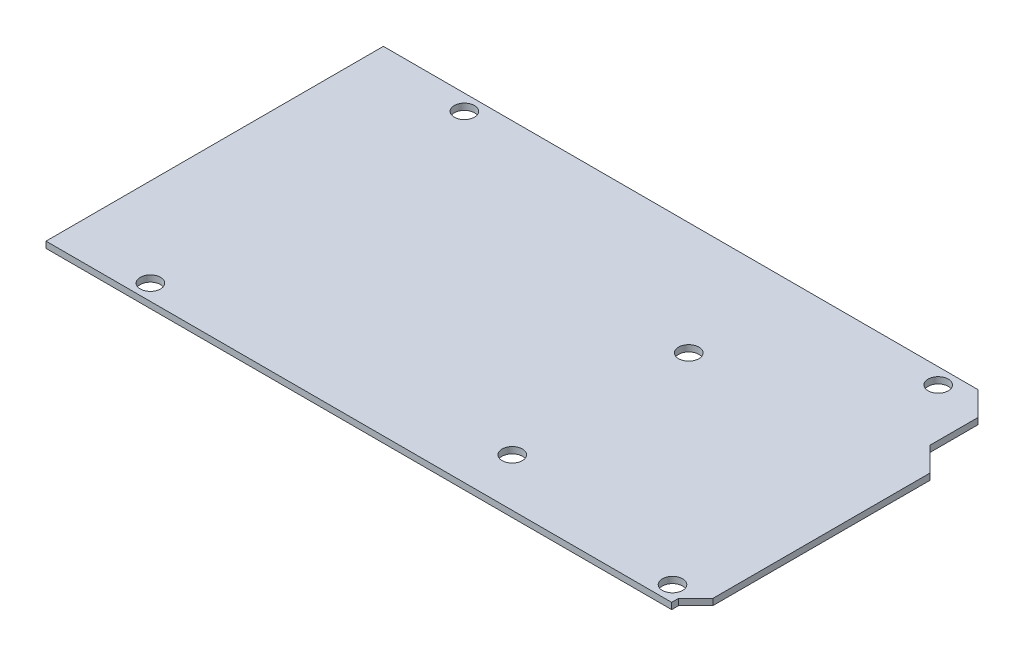
ISO-10303-21;
HEADER;
FILE_DESCRIPTION(('STEP AP214'),'2;1');
FILE_NAME('part.step','',(''),(''),'','','');
FILE_SCHEMA(('AUTOMOTIVE_DESIGN { 1 0 10303 214 1 1 1 1 }'));
ENDSEC;
DATA;
#1=APPLICATION_CONTEXT('core data for automotive mechanical design processes');
#2=APPLICATION_PROTOCOL_DEFINITION('international standard','automotive_design',2000,#1);
#3=PRODUCT_CONTEXT('',#1,'mechanical');
#4=PRODUCT('Part','Part','',(#3));
#5=PRODUCT_RELATED_PRODUCT_CATEGORY('part','',(#4));
#6=PRODUCT_DEFINITION_FORMATION('','',#4);
#7=PRODUCT_DEFINITION_CONTEXT('part definition',#1,'design');
#8=PRODUCT_DEFINITION('design','',#6,#7);
#9=PRODUCT_DEFINITION_SHAPE('','',#8);
#10=(LENGTH_UNIT() NAMED_UNIT(*) SI_UNIT(.MILLI.,.METRE.));
#11=(NAMED_UNIT(*) PLANE_ANGLE_UNIT() SI_UNIT($,.RADIAN.));
#12=(NAMED_UNIT(*) SI_UNIT($,.STERADIAN.) SOLID_ANGLE_UNIT());
#13=UNCERTAINTY_MEASURE_WITH_UNIT(LENGTH_MEASURE(1.E-05),#10,'distance_accuracy_value','');
#14=(GEOMETRIC_REPRESENTATION_CONTEXT(3) GLOBAL_UNCERTAINTY_ASSIGNED_CONTEXT((#13)) GLOBAL_UNIT_ASSIGNED_CONTEXT((#10,
#11,#12)) REPRESENTATION_CONTEXT('',''));
#15=CARTESIAN_POINT('',(0.,0.,0.));
#16=DIRECTION('',(0.,0.,1.));
#17=DIRECTION('',(1.,0.,0.));
#18=AXIS2_PLACEMENT_3D('',#15,#16,#17);
#19=CARTESIAN_POINT('',(48.9000000000001,1.,48.9));
#20=DIRECTION('',(0.707106781186548,0.,0.707106781186547));
#21=DIRECTION('',(0.707106781186547,0.,-0.707106781186548));
#22=AXIS2_PLACEMENT_3D('',#19,#20,#21);
#23=PLANE('',#22);
#24=DIRECTION('',(-0.707106781186547,0.,0.707106781186548));
#25=VECTOR('',#24,1.);
#26=CARTESIAN_POINT('',(48.9000000000001,0.,48.9));
#27=LINE('',#26,#25);
#28=CARTESIAN_POINT('',(101.61,0.,-3.80999999999999));
#29=VERTEX_POINT('',#28);
#30=CARTESIAN_POINT('',(98.9,0.,-1.09999999999999));
#31=VERTEX_POINT('',#30);
#32=EDGE_CURVE('E171',#29,#31,#27,.T.);
#33=ORIENTED_EDGE('',*,*,#32,.F.);
#34=DIRECTION('',(0.,-1.,0.));
#35=VECTOR('',#34,1.);
#36=CARTESIAN_POINT('',(101.61,1.,-3.80999999999999));
#37=LINE('',#36,#35);
#38=CARTESIAN_POINT('',(101.61,1.,-3.80999999999999));
#39=VERTEX_POINT('',#38);
#40=EDGE_CURVE('E11',#39,#29,#37,.T.);
#41=ORIENTED_EDGE('',*,*,#40,.F.);
#42=DIRECTION('',(-0.707106781186547,0.,0.707106781186548));
#43=VECTOR('',#42,1.);
#44=CARTESIAN_POINT('',(48.9000000000001,1.,48.9));
#45=LINE('',#44,#43);
#46=CARTESIAN_POINT('',(98.9,1.,-1.09999999999999));
#47=VERTEX_POINT('',#46);
#48=EDGE_CURVE('E432',#39,#47,#45,.T.);
#49=ORIENTED_EDGE('',*,*,#48,.T.);
#50=DIRECTION('',(0.,-1.,0.));
#51=VECTOR('',#50,1.);
#52=CARTESIAN_POINT('',(98.9,1.,-1.09999999999999));
#53=LINE('',#52,#51);
#54=EDGE_CURVE('E57',#47,#31,#53,.T.);
#55=ORIENTED_EDGE('',*,*,#54,.T.);
#56=EDGE_LOOP('',(#33,#41,#49,#55));
#57=FACE_BOUND('',#56,.T.);
#58=ADVANCED_FACE('F39',(#57),#23,.T.);
#59=CARTESIAN_POINT('',(101.61,1.,0.));
#60=DIRECTION('',(-1.,0.,0.));
#61=DIRECTION('',(0.,0.,1.));
#62=AXIS2_PLACEMENT_3D('',#59,#60,#61);
#63=PLANE('',#62);
#64=DIRECTION('',(0.,0.,-1.));
#65=VECTOR('',#64,1.);
#66=CARTESIAN_POINT('',(101.61,0.,0.));
#67=LINE('',#66,#65);
#68=CARTESIAN_POINT('',(101.61,0.,-38.09));
#69=VERTEX_POINT('',#68);
#70=EDGE_CURVE('E174',#29,#69,#67,.T.);
#71=ORIENTED_EDGE('',*,*,#70,.T.);
#72=DIRECTION('',(0.,-1.,0.));
#73=VECTOR('',#72,1.);
#74=CARTESIAN_POINT('',(101.61,1.,-38.09));
#75=LINE('',#74,#73);
#76=CARTESIAN_POINT('',(101.61,1.,-38.09));
#77=VERTEX_POINT('',#76);
#78=EDGE_CURVE('E49',#77,#69,#75,.T.);
#79=ORIENTED_EDGE('',*,*,#78,.F.);
#80=DIRECTION('',(0.,0.,-1.));
#81=VECTOR('',#80,1.);
#82=CARTESIAN_POINT('',(101.61,1.,0.));
#83=LINE('',#82,#81);
#84=EDGE_CURVE('E427',#39,#77,#83,.T.);
#85=ORIENTED_EDGE('',*,*,#84,.F.);
#86=ORIENTED_EDGE('',*,*,#40,.T.);
#87=EDGE_LOOP('',(#71,#79,#85,#86));
#88=FACE_BOUND('',#87,.T.);
#89=ADVANCED_FACE('F228',(#88),#63,.F.);
#90=CARTESIAN_POINT('',(69.8500000000001,1.,-69.85));
#91=DIRECTION('',(-0.707106781186548,0.,0.707106781186547));
#92=DIRECTION('',(0.707106781186547,0.,0.707106781186548));
#93=AXIS2_PLACEMENT_3D('',#90,#91,#92);
#94=PLANE('',#93);
#95=DIRECTION('',(-0.707106781186547,0.,-0.707106781186548));
#96=VECTOR('',#95,1.);
#97=CARTESIAN_POINT('',(69.8500000000001,0.,-69.85));
#98=LINE('',#97,#96);
#99=CARTESIAN_POINT('',(97.8,0.,-41.9));
#100=VERTEX_POINT('',#99);
#101=EDGE_CURVE('E178',#69,#100,#98,.T.);
#102=ORIENTED_EDGE('',*,*,#101,.T.);
#103=DIRECTION('',(0.,-1.,0.));
#104=VECTOR('',#103,1.);
#105=CARTESIAN_POINT('',(97.8,1.,-41.9));
#106=LINE('',#105,#104);
#107=CARTESIAN_POINT('',(97.8,1.,-41.9));
#108=VERTEX_POINT('',#107);
#109=EDGE_CURVE('E216',#108,#100,#106,.T.);
#110=ORIENTED_EDGE('',*,*,#109,.F.);
#111=DIRECTION('',(-0.707106781186547,0.,-0.707106781186548));
#112=VECTOR('',#111,1.);
#113=CARTESIAN_POINT('',(69.8500000000001,1.,-69.85));
#114=LINE('',#113,#112);
#115=EDGE_CURVE('E224',#77,#108,#114,.T.);
#116=ORIENTED_EDGE('',*,*,#115,.F.);
#117=ORIENTED_EDGE('',*,*,#78,.T.);
#118=EDGE_LOOP('',(#102,#110,#116,#117));
#119=FACE_BOUND('',#118,.T.);
#120=ADVANCED_FACE('F222',(#119),#94,.F.);
#121=CARTESIAN_POINT('',(97.8,1.,0.));
#122=DIRECTION('',(1.,0.,0.));
#123=DIRECTION('',(0.,0.,-1.));
#124=AXIS2_PLACEMENT_3D('',#121,#122,#123);
#125=PLANE('',#124);
#126=DIRECTION('',(0.,0.,1.));
#127=VECTOR('',#126,1.);
#128=CARTESIAN_POINT('',(97.8,0.,0.));
#129=LINE('',#128,#127);
#130=CARTESIAN_POINT('',(97.8,0.,-49.52));
#131=VERTEX_POINT('',#130);
#132=EDGE_CURVE('E182',#131,#100,#129,.T.);
#133=ORIENTED_EDGE('',*,*,#132,.F.);
#134=DIRECTION('',(0.,-1.,0.));
#135=VECTOR('',#134,1.);
#136=CARTESIAN_POINT('',(97.8,1.,-49.52));
#137=LINE('',#136,#135);
#138=CARTESIAN_POINT('',(97.8,1.,-49.52));
#139=VERTEX_POINT('',#138);
#140=EDGE_CURVE('E213',#139,#131,#137,.T.);
#141=ORIENTED_EDGE('',*,*,#140,.F.);
#142=DIRECTION('',(0.,0.,1.));
#143=VECTOR('',#142,1.);
#144=CARTESIAN_POINT('',(97.8,1.,0.));
#145=LINE('',#144,#143);
#146=EDGE_CURVE('E423',#139,#108,#145,.T.);
#147=ORIENTED_EDGE('',*,*,#146,.T.);
#148=ORIENTED_EDGE('',*,*,#109,.T.);
#149=EDGE_LOOP('',(#133,#141,#147,#148));
#150=FACE_BOUND('',#149,.T.);
#151=ADVANCED_FACE('F302',(#150),#125,.T.);
#152=CARTESIAN_POINT('',(73.6600000000001,1.,-73.66));
#153=DIRECTION('',(-0.707106781186548,0.,0.707106781186547));
#154=DIRECTION('',(0.707106781186547,0.,0.707106781186548));
#155=AXIS2_PLACEMENT_3D('',#152,#153,#154);
#156=PLANE('',#155);
#157=DIRECTION('',(-0.707106781186547,0.,-0.707106781186548));
#158=VECTOR('',#157,1.);
#159=CARTESIAN_POINT('',(73.6600000000001,0.,-73.66));
#160=LINE('',#159,#158);
#161=CARTESIAN_POINT('',(93.99,0.,-53.33));
#162=VERTEX_POINT('',#161);
#163=EDGE_CURVE('E186',#131,#162,#160,.T.);
#164=ORIENTED_EDGE('',*,*,#163,.T.);
#165=DIRECTION('',(0.,-1.,0.));
#166=VECTOR('',#165,1.);
#167=CARTESIAN_POINT('',(93.99,1.,-53.33));
#168=LINE('',#167,#166);
#169=CARTESIAN_POINT('',(93.99,1.,-53.33));
#170=VERTEX_POINT('',#169);
#171=EDGE_CURVE('E210',#170,#162,#168,.T.);
#172=ORIENTED_EDGE('',*,*,#171,.F.);
#173=DIRECTION('',(-0.707106781186547,0.,-0.707106781186548));
#174=VECTOR('',#173,1.);
#175=CARTESIAN_POINT('',(73.6600000000001,1.,-73.66));
#176=LINE('',#175,#174);
#177=EDGE_CURVE('E141',#139,#170,#176,.T.);
#178=ORIENTED_EDGE('',*,*,#177,.F.);
#179=ORIENTED_EDGE('',*,*,#140,.T.);
#180=EDGE_LOOP('',(#164,#172,#178,#179));
#181=FACE_BOUND('',#180,.T.);
#182=ADVANCED_FACE('F298',(#181),#156,.F.);
#183=CARTESIAN_POINT('',(0.,1.,-53.33));
#184=DIRECTION('',(0.,0.,-1.));
#185=DIRECTION('',(-1.,0.,0.));
#186=AXIS2_PLACEMENT_3D('',#183,#184,#185);
#187=PLANE('',#186);
#188=DIRECTION('',(1.,0.,0.));
#189=VECTOR('',#188,1.);
#190=CARTESIAN_POINT('',(0.,0.,-53.33));
#191=LINE('',#190,#189);
#192=CARTESIAN_POINT('',(0.,0.,-53.33));
#193=VERTEX_POINT('',#192);
#194=EDGE_CURVE('E190',#193,#162,#191,.T.);
#195=ORIENTED_EDGE('',*,*,#194,.F.);
#196=DIRECTION('',(0.,-1.,0.));
#197=VECTOR('',#196,1.);
#198=CARTESIAN_POINT('',(0.,1.,-53.33));
#199=LINE('',#198,#197);
#200=CARTESIAN_POINT('',(0.,1.,-53.33));
#201=VERTEX_POINT('',#200);
#202=EDGE_CURVE('E124',#201,#193,#199,.T.);
#203=ORIENTED_EDGE('',*,*,#202,.F.);
#204=DIRECTION('',(1.,0.,0.));
#205=VECTOR('',#204,1.);
#206=CARTESIAN_POINT('',(0.,1.,-53.33));
#207=LINE('',#206,#205);
#208=EDGE_CURVE('E137',#201,#170,#207,.T.);
#209=ORIENTED_EDGE('',*,*,#208,.T.);
#210=ORIENTED_EDGE('',*,*,#171,.T.);
#211=EDGE_LOOP('',(#195,#203,#209,#210));
#212=FACE_BOUND('',#211,.T.);
#213=ADVANCED_FACE('F295',(#212),#187,.T.);
#214=CARTESIAN_POINT('',(0.,1.,0.));
#215=DIRECTION('',(-1.,0.,0.));
#216=DIRECTION('',(0.,0.,1.));
#217=AXIS2_PLACEMENT_3D('',#214,#215,#216);
#218=PLANE('',#217);
#219=DIRECTION('',(0.,0.,-1.));
#220=VECTOR('',#219,1.);
#221=CARTESIAN_POINT('',(0.,0.,0.));
#222=LINE('',#221,#220);
#223=CARTESIAN_POINT('',(0.,0.,0.));
#224=VERTEX_POINT('',#223);
#225=EDGE_CURVE('E120',#224,#193,#222,.T.);
#226=ORIENTED_EDGE('',*,*,#225,.F.);
#227=DIRECTION('',(0.,-1.,0.));
#228=VECTOR('',#227,1.);
#229=CARTESIAN_POINT('',(0.,1.,0.));
#230=LINE('',#229,#228);
#231=CARTESIAN_POINT('',(0.,1.,0.));
#232=VERTEX_POINT('',#231);
#233=EDGE_CURVE('E114',#232,#224,#230,.T.);
#234=ORIENTED_EDGE('',*,*,#233,.F.);
#235=DIRECTION('',(0.,0.,-1.));
#236=VECTOR('',#235,1.);
#237=CARTESIAN_POINT('',(0.,1.,0.));
#238=LINE('',#237,#236);
#239=EDGE_CURVE('E118',#232,#201,#238,.T.);
#240=ORIENTED_EDGE('',*,*,#239,.T.);
#241=ORIENTED_EDGE('',*,*,#202,.T.);
#242=EDGE_LOOP('',(#226,#234,#240,#241));
#243=FACE_BOUND('',#242,.T.);
#244=ADVANCED_FACE('F116',(#243),#218,.T.);
#245=CARTESIAN_POINT('',(0.,1.,0.));
#246=DIRECTION('',(0.,0.,-1.));
#247=DIRECTION('',(-1.,0.,0.));
#248=AXIS2_PLACEMENT_3D('',#245,#246,#247);
#249=PLANE('',#248);
#250=DIRECTION('',(1.,0.,0.));
#251=VECTOR('',#250,1.);
#252=CARTESIAN_POINT('',(0.,0.,0.));
#253=LINE('',#252,#251);
#254=CARTESIAN_POINT('',(98.9,0.,0.));
#255=VERTEX_POINT('',#254);
#256=EDGE_CURVE('E196',#224,#255,#253,.T.);
#257=ORIENTED_EDGE('',*,*,#256,.T.);
#258=DIRECTION('',(0.,-1.,0.));
#259=VECTOR('',#258,1.);
#260=CARTESIAN_POINT('',(98.9,1.,0.));
#261=LINE('',#260,#259);
#262=CARTESIAN_POINT('',(98.9,1.,0.));
#263=VERTEX_POINT('',#262);
#264=EDGE_CURVE('E86',#263,#255,#261,.T.);
#265=ORIENTED_EDGE('',*,*,#264,.F.);
#266=DIRECTION('',(1.,0.,0.));
#267=VECTOR('',#266,1.);
#268=CARTESIAN_POINT('',(0.,1.,0.));
#269=LINE('',#268,#267);
#270=EDGE_CURVE('E126',#232,#263,#269,.T.);
#271=ORIENTED_EDGE('',*,*,#270,.F.);
#272=ORIENTED_EDGE('',*,*,#233,.T.);
#273=EDGE_LOOP('',(#257,#265,#271,#272));
#274=FACE_BOUND('',#273,.T.);
#275=ADVANCED_FACE('F127',(#274),#249,.F.);
#276=CARTESIAN_POINT('',(14.,1.,-2.5));
#277=DIRECTION('',(0.,-1.,0.));
#278=DIRECTION('',(0.,0.,-1.));
#279=AXIS2_PLACEMENT_3D('',#276,#277,#278);
#280=CYLINDRICAL_SURFACE('',#279,1.6);
#281=CARTESIAN_POINT('',(14.,1.,-2.5));
#282=DIRECTION('',(0.,1.,0.));
#283=DIRECTION('',(0.,0.,1.));
#284=AXIS2_PLACEMENT_3D('',#281,#282,#283);
#285=CIRCLE('',#284,1.6);
#286=CARTESIAN_POINT('',(14.,1.,-0.899999999999998));
#287=VERTEX_POINT('',#286);
#288=EDGE_CURVE('E435',#287,#287,#285,.T.);
#289=ORIENTED_EDGE('',*,*,#288,.T.);
#290=EDGE_LOOP('',(#289));
#291=FACE_BOUND('',#290,.T.);
#292=CARTESIAN_POINT('',(14.,0.,-2.5));
#293=DIRECTION('',(0.,1.,0.));
#294=DIRECTION('',(0.,0.,1.));
#295=AXIS2_PLACEMENT_3D('',#292,#293,#294);
#296=CIRCLE('',#295,1.6);
#297=CARTESIAN_POINT('',(14.,0.,-0.899999999999998));
#298=VERTEX_POINT('',#297);
#299=EDGE_CURVE('E167',#298,#298,#296,.T.);
#300=ORIENTED_EDGE('',*,*,#299,.F.);
#301=EDGE_LOOP('',(#300));
#302=FACE_BOUND('',#301,.T.);
#303=ADVANCED_FACE('F239',(#291,#302),#280,.F.);
#304=CARTESIAN_POINT('',(15.3,1.,-50.83));
#305=DIRECTION('',(0.,-1.,0.));
#306=DIRECTION('',(0.,0.,-1.));
#307=AXIS2_PLACEMENT_3D('',#304,#305,#306);
#308=CYLINDRICAL_SURFACE('',#307,1.6);
#309=CARTESIAN_POINT('',(15.3,1.,-50.83));
#310=DIRECTION('',(0.,1.,0.));
#311=DIRECTION('',(0.,0.,1.));
#312=AXIS2_PLACEMENT_3D('',#309,#310,#311);
#313=CIRCLE('',#312,1.6);
#314=CARTESIAN_POINT('',(15.3,1.,-49.23));
#315=VERTEX_POINT('',#314);
#316=EDGE_CURVE('E439',#315,#315,#313,.T.);
#317=ORIENTED_EDGE('',*,*,#316,.T.);
#318=EDGE_LOOP('',(#317));
#319=FACE_BOUND('',#318,.T.);
#320=CARTESIAN_POINT('',(15.3,0.,-50.83));
#321=DIRECTION('',(0.,1.,0.));
#322=DIRECTION('',(0.,0.,1.));
#323=AXIS2_PLACEMENT_3D('',#320,#321,#322);
#324=CIRCLE('',#323,1.6);
#325=CARTESIAN_POINT('',(15.3,0.,-49.23));
#326=VERTEX_POINT('',#325);
#327=EDGE_CURVE('E163',#326,#326,#324,.T.);
#328=ORIENTED_EDGE('',*,*,#327,.F.);
#329=EDGE_LOOP('',(#328));
#330=FACE_BOUND('',#329,.T.);
#331=ADVANCED_FACE('F242',(#319,#330),#308,.F.);
#332=CARTESIAN_POINT('',(66.1,1.,-35.5));
#333=DIRECTION('',(0.,-1.,0.));
#334=DIRECTION('',(0.,0.,-1.));
#335=AXIS2_PLACEMENT_3D('',#332,#333,#334);
#336=CYLINDRICAL_SURFACE('',#335,1.60000000000001);
#337=CARTESIAN_POINT('',(66.1,1.,-35.5));
#338=DIRECTION('',(0.,1.,0.));
#339=DIRECTION('',(0.,0.,1.));
#340=AXIS2_PLACEMENT_3D('',#337,#338,#339);
#341=CIRCLE('',#340,1.60000000000001);
#342=CARTESIAN_POINT('',(66.1,1.,-33.9));
#343=VERTEX_POINT('',#342);
#344=EDGE_CURVE('E443',#343,#343,#341,.T.);
#345=ORIENTED_EDGE('',*,*,#344,.T.);
#346=EDGE_LOOP('',(#345));
#347=FACE_BOUND('',#346,.T.);
#348=CARTESIAN_POINT('',(66.1,0.,-35.5));
#349=DIRECTION('',(0.,1.,0.));
#350=DIRECTION('',(0.,0.,1.));
#351=AXIS2_PLACEMENT_3D('',#348,#349,#350);
#352=CIRCLE('',#351,1.60000000000001);
#353=CARTESIAN_POINT('',(66.1,0.,-33.9));
#354=VERTEX_POINT('',#353);
#355=EDGE_CURVE('E159',#354,#354,#352,.T.);
#356=ORIENTED_EDGE('',*,*,#355,.F.);
#357=EDGE_LOOP('',(#356));
#358=FACE_BOUND('',#357,.T.);
#359=ADVANCED_FACE('F246',(#347,#358),#336,.F.);
#360=CARTESIAN_POINT('',(66.1,1.,-7.6));
#361=DIRECTION('',(0.,-1.,0.));
#362=DIRECTION('',(0.,0.,-1.));
#363=AXIS2_PLACEMENT_3D('',#360,#361,#362);
#364=CYLINDRICAL_SURFACE('',#363,1.60000000000001);
#365=CARTESIAN_POINT('',(66.1,1.,-7.6));
#366=DIRECTION('',(0.,1.,0.));
#367=DIRECTION('',(0.,0.,1.));
#368=AXIS2_PLACEMENT_3D('',#365,#366,#367);
#369=CIRCLE('',#368,1.60000000000001);
#370=CARTESIAN_POINT('',(66.1,1.,-5.99999999999999));
#371=VERTEX_POINT('',#370);
#372=EDGE_CURVE('E447',#371,#371,#369,.T.);
#373=ORIENTED_EDGE('',*,*,#372,.T.);
#374=EDGE_LOOP('',(#373));
#375=FACE_BOUND('',#374,.T.);
#376=CARTESIAN_POINT('',(66.1,0.,-7.6));
#377=DIRECTION('',(0.,1.,0.));
#378=DIRECTION('',(0.,0.,1.));
#379=AXIS2_PLACEMENT_3D('',#376,#377,#378);
#380=CIRCLE('',#379,1.60000000000001);
#381=CARTESIAN_POINT('',(66.1,0.,-5.99999999999999));
#382=VERTEX_POINT('',#381);
#383=EDGE_CURVE('E155',#382,#382,#380,.T.);
#384=ORIENTED_EDGE('',*,*,#383,.F.);
#385=EDGE_LOOP('',(#384));
#386=FACE_BOUND('',#385,.T.);
#387=ADVANCED_FACE('F250',(#375,#386),#364,.F.);
#388=CARTESIAN_POINT('',(90.2,1.,-50.83));
#389=DIRECTION('',(0.,-1.,0.));
#390=DIRECTION('',(0.,0.,-1.));
#391=AXIS2_PLACEMENT_3D('',#388,#389,#390);
#392=CYLINDRICAL_SURFACE('',#391,1.60000000000001);
#393=CARTESIAN_POINT('',(90.2,1.,-50.83));
#394=DIRECTION('',(0.,1.,0.));
#395=DIRECTION('',(0.,0.,1.));
#396=AXIS2_PLACEMENT_3D('',#393,#394,#395);
#397=CIRCLE('',#396,1.60000000000001);
#398=CARTESIAN_POINT('',(90.2,1.,-49.23));
#399=VERTEX_POINT('',#398);
#400=EDGE_CURVE('E265',#399,#399,#397,.T.);
#401=ORIENTED_EDGE('',*,*,#400,.T.);
#402=EDGE_LOOP('',(#401));
#403=FACE_BOUND('',#402,.T.);
#404=CARTESIAN_POINT('',(90.2,0.,-50.83));
#405=DIRECTION('',(0.,1.,0.));
#406=DIRECTION('',(0.,0.,1.));
#407=AXIS2_PLACEMENT_3D('',#404,#405,#406);
#408=CIRCLE('',#407,1.60000000000001);
#409=CARTESIAN_POINT('',(90.2,0.,-49.23));
#410=VERTEX_POINT('',#409);
#411=EDGE_CURVE('E151',#410,#410,#408,.T.);
#412=ORIENTED_EDGE('',*,*,#411,.F.);
#413=EDGE_LOOP('',(#412));
#414=FACE_BOUND('',#413,.T.);
#415=ADVANCED_FACE('F253',(#403,#414),#392,.F.);
#416=CARTESIAN_POINT('',(96.53,1.,-2.5));
#417=DIRECTION('',(0.,-1.,0.));
#418=DIRECTION('',(0.,0.,-1.));
#419=AXIS2_PLACEMENT_3D('',#416,#417,#418);
#420=CYLINDRICAL_SURFACE('',#419,1.60000000000001);
#421=CARTESIAN_POINT('',(96.53,1.,-2.5));
#422=DIRECTION('',(0.,1.,0.));
#423=DIRECTION('',(0.,0.,1.));
#424=AXIS2_PLACEMENT_3D('',#421,#422,#423);
#425=CIRCLE('',#424,1.60000000000001);
#426=CARTESIAN_POINT('',(96.53,1.,-0.899999999999995));
#427=VERTEX_POINT('',#426);
#428=EDGE_CURVE('E203',#427,#427,#425,.T.);
#429=ORIENTED_EDGE('',*,*,#428,.T.);
#430=EDGE_LOOP('',(#429));
#431=FACE_BOUND('',#430,.T.);
#432=CARTESIAN_POINT('',(96.53,0.,-2.5));
#433=DIRECTION('',(0.,1.,0.));
#434=DIRECTION('',(0.,0.,1.));
#435=AXIS2_PLACEMENT_3D('',#432,#433,#434);
#436=CIRCLE('',#435,1.60000000000001);
#437=CARTESIAN_POINT('',(96.53,0.,-0.899999999999995));
#438=VERTEX_POINT('',#437);
#439=EDGE_CURVE('E147',#438,#438,#436,.T.);
#440=ORIENTED_EDGE('',*,*,#439,.F.);
#441=EDGE_LOOP('',(#440));
#442=FACE_BOUND('',#441,.T.);
#443=ADVANCED_FACE('F41',(#431,#442),#420,.F.);
#444=CARTESIAN_POINT('',(98.9,1.,0.));
#445=DIRECTION('',(1.,0.,0.));
#446=DIRECTION('',(0.,0.,-1.));
#447=AXIS2_PLACEMENT_3D('',#444,#445,#446);
#448=PLANE('',#447);
#449=DIRECTION('',(0.,0.,1.));
#450=VECTOR('',#449,1.);
#451=CARTESIAN_POINT('',(98.9,0.,0.));
#452=LINE('',#451,#450);
#453=EDGE_CURVE('E199',#31,#255,#452,.T.);
#454=ORIENTED_EDGE('',*,*,#453,.F.);
#455=ORIENTED_EDGE('',*,*,#54,.F.);
#456=DIRECTION('',(0.,0.,1.));
#457=VECTOR('',#456,1.);
#458=CARTESIAN_POINT('',(98.9,1.,0.));
#459=LINE('',#458,#457);
#460=EDGE_CURVE('E131',#47,#263,#459,.T.);
#461=ORIENTED_EDGE('',*,*,#460,.T.);
#462=ORIENTED_EDGE('',*,*,#264,.T.);
#463=EDGE_LOOP('',(#454,#455,#461,#462));
#464=FACE_BOUND('',#463,.T.);
#465=ADVANCED_FACE('F260',(#464),#448,.T.);
#466=CARTESIAN_POINT('',(0.,1.,0.));
#467=DIRECTION('',(0.,1.,0.));
#468=DIRECTION('',(0.,0.,1.));
#469=AXIS2_PLACEMENT_3D('',#466,#467,#468);
#470=PLANE('',#469);
#471=ORIENTED_EDGE('',*,*,#428,.F.);
#472=EDGE_LOOP('',(#471));
#473=FACE_BOUND('',#472,.T.);
#474=ORIENTED_EDGE('',*,*,#400,.F.);
#475=EDGE_LOOP('',(#474));
#476=FACE_BOUND('',#475,.T.);
#477=ORIENTED_EDGE('',*,*,#372,.F.);
#478=EDGE_LOOP('',(#477));
#479=FACE_BOUND('',#478,.T.);
#480=ORIENTED_EDGE('',*,*,#344,.F.);
#481=EDGE_LOOP('',(#480));
#482=FACE_BOUND('',#481,.T.);
#483=ORIENTED_EDGE('',*,*,#316,.F.);
#484=EDGE_LOOP('',(#483));
#485=FACE_BOUND('',#484,.T.);
#486=ORIENTED_EDGE('',*,*,#288,.F.);
#487=EDGE_LOOP('',(#486));
#488=FACE_BOUND('',#487,.T.);
#489=ORIENTED_EDGE('',*,*,#48,.F.);
#490=ORIENTED_EDGE('',*,*,#84,.T.);
#491=ORIENTED_EDGE('',*,*,#115,.T.);
#492=ORIENTED_EDGE('',*,*,#146,.F.);
#493=ORIENTED_EDGE('',*,*,#177,.T.);
#494=ORIENTED_EDGE('',*,*,#208,.F.);
#495=ORIENTED_EDGE('',*,*,#239,.F.);
#496=ORIENTED_EDGE('',*,*,#270,.T.);
#497=ORIENTED_EDGE('',*,*,#460,.F.);
#498=EDGE_LOOP('',(#489,#490,#491,#492,#493,#494,#495,#496,#497));
#499=FACE_BOUND('',#498,.T.);
#500=ADVANCED_FACE('F135',(#473,#476,#479,#482,#485,#488,#499),#470,.T.);
#501=CARTESIAN_POINT('',(0.,0.,0.));
#502=DIRECTION('',(0.,1.,0.));
#503=DIRECTION('',(0.,0.,1.));
#504=AXIS2_PLACEMENT_3D('',#501,#502,#503);
#505=PLANE('',#504);
#506=ORIENTED_EDGE('',*,*,#439,.T.);
#507=EDGE_LOOP('',(#506));
#508=FACE_BOUND('',#507,.T.);
#509=ORIENTED_EDGE('',*,*,#411,.T.);
#510=EDGE_LOOP('',(#509));
#511=FACE_BOUND('',#510,.T.);
#512=ORIENTED_EDGE('',*,*,#383,.T.);
#513=EDGE_LOOP('',(#512));
#514=FACE_BOUND('',#513,.T.);
#515=ORIENTED_EDGE('',*,*,#355,.T.);
#516=EDGE_LOOP('',(#515));
#517=FACE_BOUND('',#516,.T.);
#518=ORIENTED_EDGE('',*,*,#327,.T.);
#519=EDGE_LOOP('',(#518));
#520=FACE_BOUND('',#519,.T.);
#521=ORIENTED_EDGE('',*,*,#299,.T.);
#522=EDGE_LOOP('',(#521));
#523=FACE_BOUND('',#522,.T.);
#524=ORIENTED_EDGE('',*,*,#32,.T.);
#525=ORIENTED_EDGE('',*,*,#453,.T.);
#526=ORIENTED_EDGE('',*,*,#256,.F.);
#527=ORIENTED_EDGE('',*,*,#225,.T.);
#528=ORIENTED_EDGE('',*,*,#194,.T.);
#529=ORIENTED_EDGE('',*,*,#163,.F.);
#530=ORIENTED_EDGE('',*,*,#132,.T.);
#531=ORIENTED_EDGE('',*,*,#101,.F.);
#532=ORIENTED_EDGE('',*,*,#70,.F.);
#533=EDGE_LOOP('',(#524,#525,#526,#527,#528,#529,#530,#531,#532));
#534=FACE_BOUND('',#533,.T.);
#535=ADVANCED_FACE('F230',(#508,#511,#514,#517,#520,#523,#534),#505,.F.);
#536=CLOSED_SHELL('',(#58,#89,#120,#151,#182,#213,#244,#275,#303,#331,#359,#387,#415,#443,#465,
#500,#535));
#537=MANIFOLD_SOLID_BREP('B2',#536);
#538=ADVANCED_BREP_SHAPE_REPRESENTATION('',(#18,#537),#14);
#539=SHAPE_DEFINITION_REPRESENTATION(#9,#538);
ENDSEC;
END-ISO-10303-21;
